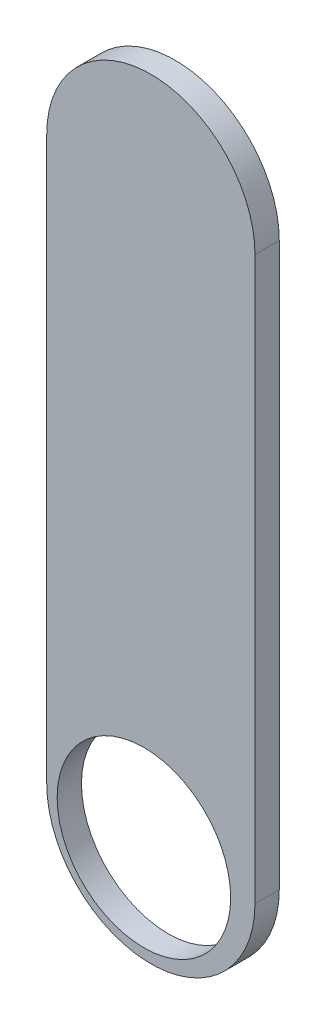
ISO-10303-21;
HEADER;
FILE_DESCRIPTION(('STEP AP214'),'2;1');
FILE_NAME('part.step','',(''),(''),'','','');
FILE_SCHEMA(('AUTOMOTIVE_DESIGN { 1 0 10303 214 1 1 1 1 }'));
ENDSEC;
DATA;
#1=APPLICATION_CONTEXT('core data for automotive mechanical design processes');
#2=APPLICATION_PROTOCOL_DEFINITION('international standard','automotive_design',2000,#1);
#3=PRODUCT_CONTEXT('',#1,'mechanical');
#4=PRODUCT('Part','Part','',(#3));
#5=PRODUCT_RELATED_PRODUCT_CATEGORY('part','',(#4));
#6=PRODUCT_DEFINITION_FORMATION('','',#4);
#7=PRODUCT_DEFINITION_CONTEXT('part definition',#1,'design');
#8=PRODUCT_DEFINITION('design','',#6,#7);
#9=PRODUCT_DEFINITION_SHAPE('','',#8);
#10=(LENGTH_UNIT() NAMED_UNIT(*) SI_UNIT(.MILLI.,.METRE.));
#11=(NAMED_UNIT(*) PLANE_ANGLE_UNIT() SI_UNIT($,.RADIAN.));
#12=(NAMED_UNIT(*) SI_UNIT($,.STERADIAN.) SOLID_ANGLE_UNIT());
#13=UNCERTAINTY_MEASURE_WITH_UNIT(LENGTH_MEASURE(1.E-05),#10,'distance_accuracy_value','');
#14=(GEOMETRIC_REPRESENTATION_CONTEXT(3) GLOBAL_UNCERTAINTY_ASSIGNED_CONTEXT((#13)) GLOBAL_UNIT_ASSIGNED_CONTEXT((#10,
#11,#12)) REPRESENTATION_CONTEXT('',''));
#15=CARTESIAN_POINT('',(0.,0.,0.));
#16=DIRECTION('',(0.,0.,1.));
#17=DIRECTION('',(1.,0.,0.));
#18=AXIS2_PLACEMENT_3D('',#15,#16,#17);
#19=CARTESIAN_POINT('',(133.24,-64.55,-0.045));
#20=DIRECTION('',(0.,0.,-1.));
#21=DIRECTION('',(0.,-1.,0.));
#22=AXIS2_PLACEMENT_3D('',#19,#20,#21);
#23=CYLINDRICAL_SURFACE('',#22,0.125);
#24=CARTESIAN_POINT('',(133.24,-64.55,1.6));
#25=DIRECTION('',(0.,0.,-1.));
#26=DIRECTION('',(0.,-1.,0.));
#27=AXIS2_PLACEMENT_3D('',#24,#25,#26);
#28=CIRCLE('',#27,0.125);
#29=CARTESIAN_POINT('',(133.24,-64.675,1.6));
#30=VERTEX_POINT('',#29);
#31=EDGE_CURVE('E115',#30,#30,#28,.T.);
#32=ORIENTED_EDGE('',*,*,#31,.T.);
#33=DIRECTION('',(0.,0.,1.));
#34=VECTOR('',#33,1.);
#35=CARTESIAN_POINT('',(133.24,-64.675,-0.045));
#36=LINE('',#35,#34);
#37=CARTESIAN_POINT('',(133.24,-64.675,1.635));
#38=VERTEX_POINT('',#37);
#39=EDGE_CURVE('E11',#30,#38,#36,.T.);
#40=ORIENTED_EDGE('',*,*,#39,.T.);
#41=CARTESIAN_POINT('',(133.24,-64.55,1.635));
#42=DIRECTION('',(0.,0.,-1.));
#43=DIRECTION('',(0.,-1.,0.));
#44=AXIS2_PLACEMENT_3D('',#41,#42,#43);
#45=CIRCLE('',#44,0.125);
#46=EDGE_CURVE('E27',#38,#38,#45,.T.);
#47=ORIENTED_EDGE('',*,*,#46,.F.);
#48=ORIENTED_EDGE('',*,*,#39,.F.);
#49=EDGE_LOOP('',(#32,#40,#47,#48));
#50=FACE_BOUND('',#49,.T.);
#51=ADVANCED_FACE('F17',(#50),#23,.F.);
#52=CARTESIAN_POINT('',(133.1,-63.73,1.6));
#53=DIRECTION('',(1.,0.,0.));
#54=DIRECTION('',(0.,1.,0.));
#55=AXIS2_PLACEMENT_3D('',#52,#53,#54);
#56=PLANE('',#55);
#57=DIRECTION('',(0.,-1.,0.));
#58=VECTOR('',#57,1.);
#59=CARTESIAN_POINT('',(133.1,-63.73,1.6));
#60=LINE('',#59,#58);
#61=CARTESIAN_POINT('',(133.1,-63.73,1.6));
#62=VERTEX_POINT('',#61);
#63=CARTESIAN_POINT('',(133.1,-64.54,1.6));
#64=VERTEX_POINT('',#63);
#65=EDGE_CURVE('E21',#62,#64,#60,.T.);
#66=ORIENTED_EDGE('',*,*,#65,.T.);
#67=DIRECTION('',(0.,0.,1.));
#68=VECTOR('',#67,1.);
#69=CARTESIAN_POINT('',(133.1,-64.54,1.6));
#70=LINE('',#69,#68);
#71=CARTESIAN_POINT('',(133.1,-64.54,1.635));
#72=VERTEX_POINT('',#71);
#73=EDGE_CURVE('E90',#64,#72,#70,.T.);
#74=ORIENTED_EDGE('',*,*,#73,.T.);
#75=DIRECTION('',(0.,-1.,0.));
#76=VECTOR('',#75,1.);
#77=CARTESIAN_POINT('',(133.1,-63.73,1.635));
#78=LINE('',#77,#76);
#79=CARTESIAN_POINT('',(133.1,-63.73,1.635));
#80=VERTEX_POINT('',#79);
#81=EDGE_CURVE('E85',#80,#72,#78,.T.);
#82=ORIENTED_EDGE('',*,*,#81,.F.);
#83=DIRECTION('',(0.,0.,1.));
#84=VECTOR('',#83,1.);
#85=CARTESIAN_POINT('',(133.1,-63.73,1.6));
#86=LINE('',#85,#84);
#87=EDGE_CURVE('E125',#62,#80,#86,.T.);
#88=ORIENTED_EDGE('',*,*,#87,.F.);
#89=EDGE_LOOP('',(#66,#74,#82,#88));
#90=FACE_BOUND('',#89,.T.);
#91=ADVANCED_FACE('F19',(#90),#56,.F.);
#92=CARTESIAN_POINT('',(133.4,-64.54,1.635));
#93=DIRECTION('',(0.,0.,1.));
#94=DIRECTION('',(1.,0.,0.));
#95=AXIS2_PLACEMENT_3D('',#92,#93,#94);
#96=PLANE('',#95);
#97=ORIENTED_EDGE('',*,*,#46,.T.);
#98=EDGE_LOOP('',(#97));
#99=FACE_BOUND('',#98,.T.);
#100=DIRECTION('',(0.,1.,0.));
#101=VECTOR('',#100,1.);
#102=CARTESIAN_POINT('',(133.4,-64.54,1.635));
#103=LINE('',#102,#101);
#104=CARTESIAN_POINT('',(133.4,-64.54,1.635));
#105=VERTEX_POINT('',#104);
#106=CARTESIAN_POINT('',(133.4,-63.73,1.635));
#107=VERTEX_POINT('',#106);
#108=EDGE_CURVE('E83',#105,#107,#103,.T.);
#109=ORIENTED_EDGE('',*,*,#108,.T.);
#110=CARTESIAN_POINT('',(133.25,-63.73,1.635));
#111=DIRECTION('',(0.,0.,1.));
#112=DIRECTION('',(1.,0.,0.));
#113=AXIS2_PLACEMENT_3D('',#110,#111,#112);
#114=CIRCLE('',#113,0.15);
#115=EDGE_CURVE('E131',#107,#80,#114,.T.);
#116=ORIENTED_EDGE('',*,*,#115,.T.);
#117=ORIENTED_EDGE('',*,*,#81,.T.);
#118=CARTESIAN_POINT('',(133.25,-64.54,1.635));
#119=DIRECTION('',(0.,0.,1.));
#120=DIRECTION('',(-1.,0.,0.));
#121=AXIS2_PLACEMENT_3D('',#118,#119,#120);
#122=CIRCLE('',#121,0.15);
#123=EDGE_CURVE('E78',#72,#105,#122,.T.);
#124=ORIENTED_EDGE('',*,*,#123,.T.);
#125=EDGE_LOOP('',(#109,#116,#117,#124));
#126=FACE_BOUND('',#125,.T.);
#127=ADVANCED_FACE('F80',(#99,#126),#96,.T.);
#128=CARTESIAN_POINT('',(133.4,-64.54,1.6));
#129=DIRECTION('',(0.,0.,1.));
#130=DIRECTION('',(1.,0.,0.));
#131=AXIS2_PLACEMENT_3D('',#128,#129,#130);
#132=PLANE('',#131);
#133=ORIENTED_EDGE('',*,*,#31,.F.);
#134=EDGE_LOOP('',(#133));
#135=FACE_BOUND('',#134,.T.);
#136=CARTESIAN_POINT('',(133.25,-64.54,1.6));
#137=DIRECTION('',(0.,0.,1.));
#138=DIRECTION('',(-1.,0.,0.));
#139=AXIS2_PLACEMENT_3D('',#136,#137,#138);
#140=CIRCLE('',#139,0.15);
#141=CARTESIAN_POINT('',(133.4,-64.54,1.6));
#142=VERTEX_POINT('',#141);
#143=EDGE_CURVE('E91',#64,#142,#140,.T.);
#144=ORIENTED_EDGE('',*,*,#143,.F.);
#145=ORIENTED_EDGE('',*,*,#65,.F.);
#146=CARTESIAN_POINT('',(133.25,-63.73,1.6));
#147=DIRECTION('',(0.,0.,1.));
#148=DIRECTION('',(1.,0.,0.));
#149=AXIS2_PLACEMENT_3D('',#146,#147,#148);
#150=CIRCLE('',#149,0.15);
#151=CARTESIAN_POINT('',(133.4,-63.73,1.6));
#152=VERTEX_POINT('',#151);
#153=EDGE_CURVE('E121',#152,#62,#150,.T.);
#154=ORIENTED_EDGE('',*,*,#153,.F.);
#155=DIRECTION('',(0.,1.,0.));
#156=VECTOR('',#155,1.);
#157=CARTESIAN_POINT('',(133.4,-64.54,1.6));
#158=LINE('',#157,#156);
#159=EDGE_CURVE('E111',#142,#152,#158,.T.);
#160=ORIENTED_EDGE('',*,*,#159,.F.);
#161=EDGE_LOOP('',(#144,#145,#154,#160));
#162=FACE_BOUND('',#161,.T.);
#163=ADVANCED_FACE('F143',(#135,#162),#132,.F.);
#164=CARTESIAN_POINT('',(133.25,-63.73,1.6));
#165=DIRECTION('',(0.,0.,-1.));
#166=DIRECTION('',(1.,0.,0.));
#167=AXIS2_PLACEMENT_3D('',#164,#165,#166);
#168=CYLINDRICAL_SURFACE('',#167,0.15);
#169=ORIENTED_EDGE('',*,*,#153,.T.);
#170=ORIENTED_EDGE('',*,*,#87,.T.);
#171=ORIENTED_EDGE('',*,*,#115,.F.);
#172=DIRECTION('',(0.,0.,1.));
#173=VECTOR('',#172,1.);
#174=CARTESIAN_POINT('',(133.4,-63.73,1.6));
#175=LINE('',#174,#173);
#176=EDGE_CURVE('E104',#152,#107,#175,.T.);
#177=ORIENTED_EDGE('',*,*,#176,.F.);
#178=EDGE_LOOP('',(#169,#170,#171,#177));
#179=FACE_BOUND('',#178,.T.);
#180=ADVANCED_FACE('F210',(#179),#168,.T.);
#181=CARTESIAN_POINT('',(133.25,-64.54,1.6));
#182=DIRECTION('',(0.,0.,-1.));
#183=DIRECTION('',(-1.,0.,0.));
#184=AXIS2_PLACEMENT_3D('',#181,#182,#183);
#185=CYLINDRICAL_SURFACE('',#184,0.15);
#186=ORIENTED_EDGE('',*,*,#143,.T.);
#187=DIRECTION('',(0.,0.,1.));
#188=VECTOR('',#187,1.);
#189=CARTESIAN_POINT('',(133.4,-64.54,1.6));
#190=LINE('',#189,#188);
#191=EDGE_CURVE('E94',#142,#105,#190,.T.);
#192=ORIENTED_EDGE('',*,*,#191,.T.);
#193=ORIENTED_EDGE('',*,*,#123,.F.);
#194=ORIENTED_EDGE('',*,*,#73,.F.);
#195=EDGE_LOOP('',(#186,#192,#193,#194));
#196=FACE_BOUND('',#195,.T.);
#197=ADVANCED_FACE('F95',(#196),#185,.T.);
#198=CARTESIAN_POINT('',(133.4,-64.54,1.6));
#199=DIRECTION('',(-1.,0.,0.));
#200=DIRECTION('',(0.,0.,1.));
#201=AXIS2_PLACEMENT_3D('',#198,#199,#200);
#202=PLANE('',#201);
#203=ORIENTED_EDGE('',*,*,#159,.T.);
#204=ORIENTED_EDGE('',*,*,#176,.T.);
#205=ORIENTED_EDGE('',*,*,#108,.F.);
#206=ORIENTED_EDGE('',*,*,#191,.F.);
#207=EDGE_LOOP('',(#203,#204,#205,#206));
#208=FACE_BOUND('',#207,.T.);
#209=ADVANCED_FACE('F102',(#208),#202,.F.);
#210=CLOSED_SHELL('',(#51,#91,#127,#163,#180,#197,#209));
#211=MANIFOLD_SOLID_BREP('B1',#210);
#212=ADVANCED_BREP_SHAPE_REPRESENTATION('',(#18,#211),#14);
#213=SHAPE_DEFINITION_REPRESENTATION(#9,#212);
ENDSEC;
END-ISO-10303-21;
